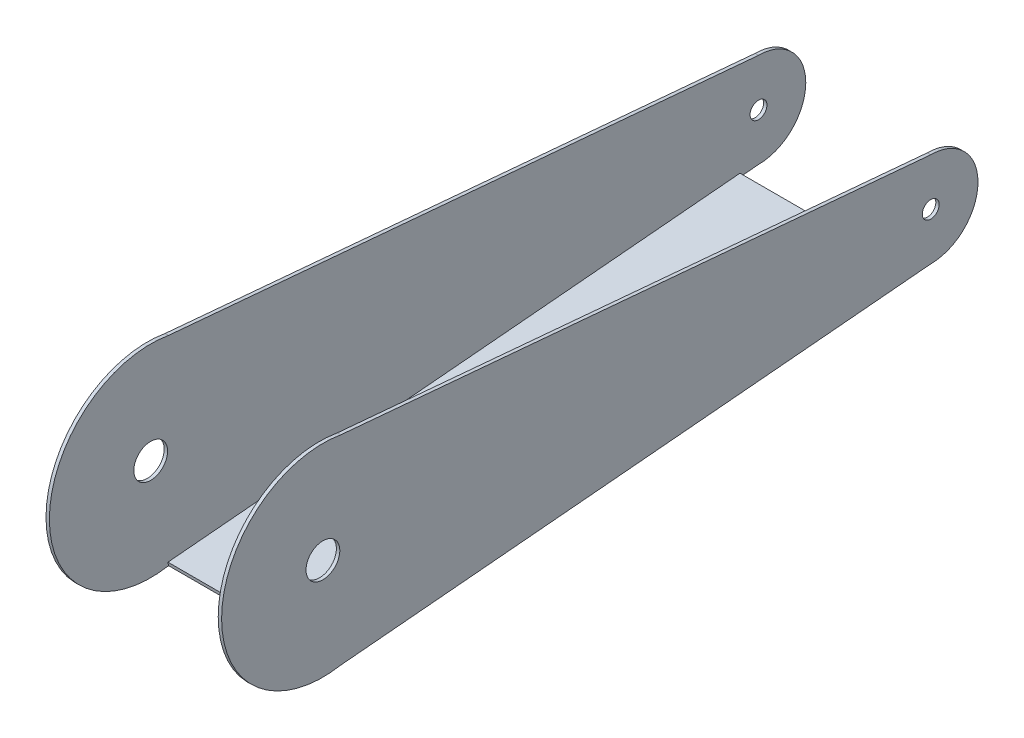
ISO-10303-21;
HEADER;
FILE_DESCRIPTION(('STEP AP214'),'2;1');
FILE_NAME('part.step','',(''),(''),'','','');
FILE_SCHEMA(('AUTOMOTIVE_DESIGN { 1 0 10303 214 1 1 1 1 }'));
ENDSEC;
DATA;
#1=APPLICATION_CONTEXT('core data for automotive mechanical design processes');
#2=APPLICATION_PROTOCOL_DEFINITION('international standard','automotive_design',2000,#1);
#3=PRODUCT_CONTEXT('',#1,'mechanical');
#4=PRODUCT('Part','Part','',(#3));
#5=PRODUCT_RELATED_PRODUCT_CATEGORY('part','',(#4));
#6=PRODUCT_DEFINITION_FORMATION('','',#4);
#7=PRODUCT_DEFINITION_CONTEXT('part definition',#1,'design');
#8=PRODUCT_DEFINITION('design','',#6,#7);
#9=PRODUCT_DEFINITION_SHAPE('','',#8);
#10=(LENGTH_UNIT() NAMED_UNIT(*) SI_UNIT(.MILLI.,.METRE.));
#11=(NAMED_UNIT(*) PLANE_ANGLE_UNIT() SI_UNIT($,.RADIAN.));
#12=(NAMED_UNIT(*) SI_UNIT($,.STERADIAN.) SOLID_ANGLE_UNIT());
#13=UNCERTAINTY_MEASURE_WITH_UNIT(LENGTH_MEASURE(1.E-05),#10,'distance_accuracy_value','');
#14=(GEOMETRIC_REPRESENTATION_CONTEXT(3) GLOBAL_UNCERTAINTY_ASSIGNED_CONTEXT((#13)) GLOBAL_UNIT_ASSIGNED_CONTEXT((#10,
#11,#12)) REPRESENTATION_CONTEXT('',''));
#15=CARTESIAN_POINT('',(0.,0.,0.));
#16=DIRECTION('',(0.,0.,1.));
#17=DIRECTION('',(1.,0.,0.));
#18=AXIS2_PLACEMENT_3D('',#15,#16,#17);
#19=CARTESIAN_POINT('',(26.,0.,0.));
#20=DIRECTION('',(-1.,0.,0.));
#21=DIRECTION('',(0.,0.,1.));
#22=AXIS2_PLACEMENT_3D('',#19,#20,#21);
#23=CYLINDRICAL_SURFACE('',#22,30.);
#24=CARTESIAN_POINT('',(-25.,0.,0.));
#25=DIRECTION('',(1.,0.,0.));
#26=DIRECTION('',(0.,0.,-1.));
#27=AXIS2_PLACEMENT_3D('',#24,#25,#26);
#28=CIRCLE('',#27,30.);
#29=CARTESIAN_POINT('',(-25.,29.5296423321901,-5.29152376286136));
#30=VERTEX_POINT('',#29);
#31=CARTESIAN_POINT('',(-25.,-29.5296423321901,-5.29152376286136));
#32=VERTEX_POINT('',#31);
#33=EDGE_CURVE('E145',#30,#32,#28,.T.);
#34=ORIENTED_EDGE('',*,*,#33,.F.);
#35=DIRECTION('',(-1.,0.,0.));
#36=VECTOR('',#35,1.);
#37=CARTESIAN_POINT('',(26.,29.5296423321901,-5.29152376286135));
#38=LINE('',#37,#36);
#39=CARTESIAN_POINT('',(-26.,29.5296423321901,-5.29152376286135));
#40=VERTEX_POINT('',#39);
#41=EDGE_CURVE('E81',#30,#40,#38,.T.);
#42=ORIENTED_EDGE('',*,*,#41,.T.);
#43=CARTESIAN_POINT('',(-26.,0.,0.));
#44=DIRECTION('',(1.,0.,0.));
#45=DIRECTION('',(0.,0.,-1.));
#46=AXIS2_PLACEMENT_3D('',#43,#44,#45);
#47=CIRCLE('',#46,30.);
#48=CARTESIAN_POINT('',(-26.,-29.5296423321901,-5.29152376286135));
#49=VERTEX_POINT('',#48);
#50=EDGE_CURVE('E195',#40,#49,#47,.T.);
#51=ORIENTED_EDGE('',*,*,#50,.T.);
#52=DIRECTION('',(-1.,0.,0.));
#53=VECTOR('',#52,1.);
#54=CARTESIAN_POINT('',(26.,-29.5296423321901,-5.29152376286135));
#55=LINE('',#54,#53);
#56=EDGE_CURVE('E42',#32,#49,#55,.T.);
#57=ORIENTED_EDGE('',*,*,#56,.F.);
#58=EDGE_LOOP('',(#34,#42,#51,#57));
#59=FACE_BOUND('',#58,.T.);
#60=ADVANCED_FACE('F33',(#59),#23,.T.);
#61=CARTESIAN_POINT('',(26.,-14.,-180.));
#62=DIRECTION('',(0.,0.996072640692687,0.0885397902837944));
#63=DIRECTION('',(0.,-0.0885397902837944,0.996072640692687));
#64=AXIS2_PLACEMENT_3D('',#61,#62,#63);
#65=PLANE('',#64);
#66=DIRECTION('',(0.,0.0885397902837943,-0.996072640692686));
#67=VECTOR('',#66,1.);
#68=CARTESIAN_POINT('',(-25.,-14.,-180.));
#69=LINE('',#68,#67);
#70=CARTESIAN_POINT('',(-25.,-14.4804390485647,-174.595060703647));
#71=VERTEX_POINT('',#70);
#72=CARTESIAN_POINT('',(-25.,-14.,-180.));
#73=VERTEX_POINT('',#72);
#74=EDGE_CURVE('E135',#71,#73,#69,.T.);
#75=ORIENTED_EDGE('',*,*,#74,.F.);
#76=DIRECTION('',(1.,0.,0.));
#77=VECTOR('',#76,1.);
#78=CARTESIAN_POINT('',(-25.,-14.4804390485647,-174.595060703647));
#79=LINE('',#78,#77);
#80=CARTESIAN_POINT('',(25.,-14.4804390485647,-174.595060703647));
#81=VERTEX_POINT('',#80);
#82=EDGE_CURVE('E165',#71,#81,#79,.T.);
#83=ORIENTED_EDGE('',*,*,#82,.T.);
#84=DIRECTION('',(0.,0.0885397902837943,-0.996072640692686));
#85=VECTOR('',#84,1.);
#86=CARTESIAN_POINT('',(25.,-14.,-180.));
#87=LINE('',#86,#85);
#88=CARTESIAN_POINT('',(25.,-14.,-180.));
#89=VERTEX_POINT('',#88);
#90=EDGE_CURVE('E139',#81,#89,#87,.T.);
#91=ORIENTED_EDGE('',*,*,#90,.T.);
#92=DIRECTION('',(-1.,0.,0.));
#93=VECTOR('',#92,1.);
#94=CARTESIAN_POINT('',(26.,-14.,-180.));
#95=LINE('',#94,#93);
#96=CARTESIAN_POINT('',(26.,-14.,-180.));
#97=VERTEX_POINT('',#96);
#98=EDGE_CURVE('E160',#97,#89,#95,.T.);
#99=ORIENTED_EDGE('',*,*,#98,.F.);
#100=DIRECTION('',(0.,0.0885397902837943,-0.996072640692686));
#101=VECTOR('',#100,1.);
#102=CARTESIAN_POINT('',(26.,-14.,-180.));
#103=LINE('',#102,#101);
#104=CARTESIAN_POINT('',(26.,-29.5296423321901,-5.29152376286135));
#105=VERTEX_POINT('',#104);
#106=EDGE_CURVE('E88',#105,#97,#103,.T.);
#107=ORIENTED_EDGE('',*,*,#106,.F.);
#108=CARTESIAN_POINT('',(25.,-29.5296423321901,-5.29152376286136));
#109=VERTEX_POINT('',#108);
#110=EDGE_CURVE('E11',#105,#109,#55,.T.);
#111=ORIENTED_EDGE('',*,*,#110,.T.);
#112=DIRECTION('',(1.,0.,0.));
#113=VECTOR('',#112,1.);
#114=CARTESIAN_POINT('',(-25.,-29.5296423321901,-5.29152376286136));
#115=LINE('',#114,#113);
#116=EDGE_CURVE('E180',#32,#109,#115,.T.);
#117=ORIENTED_EDGE('',*,*,#116,.F.);
#118=ORIENTED_EDGE('',*,*,#56,.T.);
#119=DIRECTION('',(0.,0.0885397902837943,-0.996072640692686));
#120=VECTOR('',#119,1.);
#121=CARTESIAN_POINT('',(-26.,-14.,-180.));
#122=LINE('',#121,#120);
#123=CARTESIAN_POINT('',(-26.,-14.,-180.));
#124=VERTEX_POINT('',#123);
#125=EDGE_CURVE('E206',#49,#124,#122,.T.);
#126=ORIENTED_EDGE('',*,*,#125,.T.);
#127=EDGE_CURVE('E155',#73,#124,#95,.T.);
#128=ORIENTED_EDGE('',*,*,#127,.F.);
#129=EDGE_LOOP('',(#75,#83,#91,#99,#107,#111,#117,#118,#126,#128));
#130=FACE_BOUND('',#129,.T.);
#131=ADVANCED_FACE('F216',(#130),#65,.F.);
#132=CARTESIAN_POINT('',(26.,0.,-180.));
#133=DIRECTION('',(-1.,0.,0.));
#134=DIRECTION('',(0.,0.,1.));
#135=AXIS2_PLACEMENT_3D('',#132,#133,#134);
#136=CYLINDRICAL_SURFACE('',#135,14.);
#137=CARTESIAN_POINT('',(-25.,0.,-180.));
#138=DIRECTION('',(1.,0.,0.));
#139=DIRECTION('',(0.,0.,-1.));
#140=AXIS2_PLACEMENT_3D('',#137,#138,#139);
#141=CIRCLE('',#140,14.);
#142=CARTESIAN_POINT('',(-25.,14.,-180.));
#143=VERTEX_POINT('',#142);
#144=EDGE_CURVE('E128',#73,#143,#141,.T.);
#145=ORIENTED_EDGE('',*,*,#144,.F.);
#146=ORIENTED_EDGE('',*,*,#127,.T.);
#147=CARTESIAN_POINT('',(-26.,0.,-180.));
#148=DIRECTION('',(1.,0.,0.));
#149=DIRECTION('',(0.,0.,-1.));
#150=AXIS2_PLACEMENT_3D('',#147,#148,#149);
#151=CIRCLE('',#150,14.);
#152=CARTESIAN_POINT('',(-26.,14.,-180.));
#153=VERTEX_POINT('',#152);
#154=EDGE_CURVE('E149',#124,#153,#151,.T.);
#155=ORIENTED_EDGE('',*,*,#154,.T.);
#156=DIRECTION('',(-1.,0.,0.));
#157=VECTOR('',#156,1.);
#158=CARTESIAN_POINT('',(26.,14.,-180.));
#159=LINE('',#158,#157);
#160=EDGE_CURVE('E143',#143,#153,#159,.T.);
#161=ORIENTED_EDGE('',*,*,#160,.F.);
#162=EDGE_LOOP('',(#145,#146,#155,#161));
#163=FACE_BOUND('',#162,.T.);
#164=ADVANCED_FACE('F147',(#163),#136,.T.);
#165=CARTESIAN_POINT('',(26.,29.5296423321901,-5.29152376286135));
#166=DIRECTION('',(0.,-0.996072640692687,0.0885397902837944));
#167=DIRECTION('',(0.,-0.0885397902837944,-0.996072640692687));
#168=AXIS2_PLACEMENT_3D('',#165,#166,#167);
#169=PLANE('',#168);
#170=DIRECTION('',(0.,0.0885397902837943,0.996072640692686));
#171=VECTOR('',#170,1.);
#172=CARTESIAN_POINT('',(-25.,29.5296423321901,-5.29152376286136));
#173=LINE('',#172,#171);
#174=EDGE_CURVE('E132',#143,#30,#173,.T.);
#175=ORIENTED_EDGE('',*,*,#174,.F.);
#176=ORIENTED_EDGE('',*,*,#160,.T.);
#177=DIRECTION('',(0.,0.0885397902837943,0.996072640692686));
#178=VECTOR('',#177,1.);
#179=CARTESIAN_POINT('',(-26.,29.5296423321901,-5.29152376286135));
#180=LINE('',#179,#178);
#181=EDGE_CURVE('E200',#153,#40,#180,.T.);
#182=ORIENTED_EDGE('',*,*,#181,.T.);
#183=ORIENTED_EDGE('',*,*,#41,.F.);
#184=EDGE_LOOP('',(#175,#176,#182,#183));
#185=FACE_BOUND('',#184,.T.);
#186=ADVANCED_FACE('F142',(#185),#169,.F.);
#187=CARTESIAN_POINT('',(26.,0.,0.));
#188=DIRECTION('',(-1.,0.,0.));
#189=DIRECTION('',(0.,0.,1.));
#190=AXIS2_PLACEMENT_3D('',#187,#188,#189);
#191=CYLINDRICAL_SURFACE('',#190,5.);
#192=CARTESIAN_POINT('',(-26.,0.,0.));
#193=DIRECTION('',(1.,0.,0.));
#194=DIRECTION('',(0.,0.,-1.));
#195=AXIS2_PLACEMENT_3D('',#192,#193,#194);
#196=CIRCLE('',#195,5.);
#197=CARTESIAN_POINT('',(-26.,0.,5.));
#198=VERTEX_POINT('',#197);
#199=EDGE_CURVE('E189',#198,#198,#196,.T.);
#200=CARTESIAN_POINT('',(-25.,0.,0.));
#201=DIRECTION('',(1.,0.,0.));
#202=DIRECTION('',(0.,0.,-1.));
#203=AXIS2_PLACEMENT_3D('',#200,#201,#202);
#204=CIRCLE('',#203,5.);
#205=CARTESIAN_POINT('',(-25.,0.,5.));
#206=VERTEX_POINT('',#205);
#207=EDGE_CURVE('E182',#206,#206,#204,.T.);
#208=CARTESIAN_POINT('',(-26.,0.,5.));
#209=CARTESIAN_POINT('',(-25.9895833333333,0.,5.));
#210=CARTESIAN_POINT('',(-25.9791666666667,0.,5.));
#211=CARTESIAN_POINT('',(-25.9583333333333,0.,5.));
#212=CARTESIAN_POINT('',(-25.9479166666667,0.,5.));
#213=CARTESIAN_POINT('',(-25.9270833333333,0.,5.));
#214=CARTESIAN_POINT('',(-25.9166666666667,0.,5.));
#215=CARTESIAN_POINT('',(-25.8958333333333,0.,5.));
#216=CARTESIAN_POINT('',(-25.8854166666667,0.,5.));
#217=CARTESIAN_POINT('',(-25.8645833333333,0.,5.));
#218=CARTESIAN_POINT('',(-25.8541666666667,0.,5.));
#219=CARTESIAN_POINT('',(-25.8333333333333,0.,5.));
#220=CARTESIAN_POINT('',(-25.8229166666667,0.,5.));
#221=CARTESIAN_POINT('',(-25.8020833333333,0.,5.));
#222=CARTESIAN_POINT('',(-25.7916666666667,0.,5.));
#223=CARTESIAN_POINT('',(-25.7708333333333,0.,5.));
#224=CARTESIAN_POINT('',(-25.7604166666667,0.,5.));
#225=CARTESIAN_POINT('',(-25.7395833333333,0.,5.));
#226=CARTESIAN_POINT('',(-25.7291666666667,0.,5.));
#227=CARTESIAN_POINT('',(-25.7083333333333,0.,5.));
#228=CARTESIAN_POINT('',(-25.6979166666667,0.,5.));
#229=CARTESIAN_POINT('',(-25.6770833333333,0.,5.));
#230=CARTESIAN_POINT('',(-25.6666666666667,0.,5.));
#231=CARTESIAN_POINT('',(-25.6458333333333,0.,5.));
#232=CARTESIAN_POINT('',(-25.6354166666667,0.,5.));
#233=CARTESIAN_POINT('',(-25.6145833333333,0.,5.));
#234=CARTESIAN_POINT('',(-25.6041666666667,0.,5.));
#235=CARTESIAN_POINT('',(-25.5833333333333,0.,5.));
#236=CARTESIAN_POINT('',(-25.5729166666667,0.,5.));
#237=CARTESIAN_POINT('',(-25.5520833333333,0.,5.));
#238=CARTESIAN_POINT('',(-25.5416666666667,0.,5.));
#239=CARTESIAN_POINT('',(-25.5208333333333,0.,5.));
#240=CARTESIAN_POINT('',(-25.5104166666667,0.,5.));
#241=CARTESIAN_POINT('',(-25.4895833333333,0.,5.));
#242=CARTESIAN_POINT('',(-25.4791666666667,0.,5.));
#243=CARTESIAN_POINT('',(-25.4583333333333,0.,5.));
#244=CARTESIAN_POINT('',(-25.4479166666667,0.,5.));
#245=CARTESIAN_POINT('',(-25.4270833333333,0.,5.));
#246=CARTESIAN_POINT('',(-25.4166666666667,0.,5.));
#247=CARTESIAN_POINT('',(-25.3958333333333,0.,5.));
#248=CARTESIAN_POINT('',(-25.3854166666667,0.,5.));
#249=CARTESIAN_POINT('',(-25.3645833333333,0.,5.));
#250=CARTESIAN_POINT('',(-25.3541666666667,0.,5.));
#251=CARTESIAN_POINT('',(-25.3333333333333,0.,5.));
#252=CARTESIAN_POINT('',(-25.3229166666667,0.,5.));
#253=CARTESIAN_POINT('',(-25.3020833333333,0.,5.));
#254=CARTESIAN_POINT('',(-25.2916666666667,0.,5.));
#255=CARTESIAN_POINT('',(-25.2708333333333,0.,5.));
#256=CARTESIAN_POINT('',(-25.2604166666667,0.,5.));
#257=CARTESIAN_POINT('',(-25.2395833333333,0.,5.));
#258=CARTESIAN_POINT('',(-25.2291666666667,0.,5.));
#259=CARTESIAN_POINT('',(-25.2083333333333,0.,5.));
#260=CARTESIAN_POINT('',(-25.1979166666667,0.,5.));
#261=CARTESIAN_POINT('',(-25.1770833333333,0.,5.));
#262=CARTESIAN_POINT('',(-25.1666666666667,0.,5.));
#263=CARTESIAN_POINT('',(-25.1458333333333,0.,5.));
#264=CARTESIAN_POINT('',(-25.1354166666667,0.,5.));
#265=CARTESIAN_POINT('',(-25.1145833333333,0.,5.));
#266=CARTESIAN_POINT('',(-25.1041666666667,0.,5.));
#267=CARTESIAN_POINT('',(-25.0833333333333,0.,5.));
#268=CARTESIAN_POINT('',(-25.0729166666667,0.,5.));
#269=CARTESIAN_POINT('',(-25.0520833333333,0.,5.));
#270=CARTESIAN_POINT('',(-25.0416666666667,0.,5.));
#271=CARTESIAN_POINT('',(-25.0208333333333,0.,5.));
#272=CARTESIAN_POINT('',(-25.0104166666667,0.,5.));
#273=CARTESIAN_POINT('',(-25.,0.,5.));
#274=B_SPLINE_CURVE_WITH_KNOTS('',3,(#208,#209,#210,#211,#212,#213,#214,#215,#216,#217,#218,
#219,#220,#221,#222,#223,#224,#225,#226,#227,#228,#229,#230,#231,#232,#233,#234,#235,#236,#237,
#238,#239,#240,#241,#242,#243,#244,#245,#246,#247,#248,#249,#250,#251,#252,#253,#254,#255,#256,
#257,#258,#259,#260,#261,#262,#263,#264,#265,#266,#267,#268,#269,#270,#271,#272,#273),
.UNSPECIFIED.,.F.,.F.,(4,2,2,2,2,2,2,2,2,2,2,2,2,2,2,2,2,2,2,2,2,2,2,2,2,2,2,2,2,2,2,2,4),(0.,
0.0312499999999966,0.0625000000000001,0.0937499999999966,0.125,0.156249999999997,0.1875,
0.218749999999997,0.25,0.281249999999997,0.312499999999993,0.343749999999997,0.374999999999993,
0.406249999999997,0.437499999999993,0.468749999999997,0.499999999999994,0.53124999999999,
0.562499999999994,0.59374999999999,0.624999999999994,0.65624999999999,0.687499999999994,
0.71874999999999,0.749999999999987,0.78124999999999,0.812499999999987,0.84374999999999,
0.874999999999987,0.90624999999999,0.937499999999987,0.96874999999999,0.999999999999987),.UNSPECIFIED.);
#275=EDGE_CURVE('BSEAM269',#198,#206,#274,.T.);
#276=ORIENTED_EDGE('',*,*,#199,.F.);
#277=ORIENTED_EDGE('',*,*,#207,.T.);
#278=ORIENTED_EDGE('',*,*,#275,.T.);
#279=ORIENTED_EDGE('',*,*,#275,.F.);
#280=EDGE_LOOP('',(#276,#278,#277,#279));
#281=FACE_BOUND('',#280,.T.);
#282=ADVANCED_FACE('F269',(#281),#191,.F.);
#283=CARTESIAN_POINT('',(26.,0.,-180.));
#284=DIRECTION('',(-1.,0.,0.));
#285=DIRECTION('',(0.,0.,1.));
#286=AXIS2_PLACEMENT_3D('',#283,#284,#285);
#287=CYLINDRICAL_SURFACE('',#286,2.5);
#288=CARTESIAN_POINT('',(-26.,0.,-180.));
#289=DIRECTION('',(1.,0.,0.));
#290=DIRECTION('',(0.,0.,-1.));
#291=AXIS2_PLACEMENT_3D('',#288,#289,#290);
#292=CIRCLE('',#291,2.5);
#293=CARTESIAN_POINT('',(-26.,0.,-177.5));
#294=VERTEX_POINT('',#293);
#295=EDGE_CURVE('E185',#294,#294,#292,.T.);
#296=CARTESIAN_POINT('',(-25.,0.,-180.));
#297=DIRECTION('',(1.,0.,0.));
#298=DIRECTION('',(0.,0.,-1.));
#299=AXIS2_PLACEMENT_3D('',#296,#297,#298);
#300=CIRCLE('',#299,2.5);
#301=CARTESIAN_POINT('',(-25.,0.,-177.5));
#302=VERTEX_POINT('',#301);
#303=EDGE_CURVE('E37',#302,#302,#300,.T.);
#304=CARTESIAN_POINT('',(-26.,0.,-177.5));
#305=CARTESIAN_POINT('',(-25.9895833333333,0.,-177.5));
#306=CARTESIAN_POINT('',(-25.9791666666667,0.,-177.5));
#307=CARTESIAN_POINT('',(-25.9583333333333,0.,-177.5));
#308=CARTESIAN_POINT('',(-25.9479166666667,0.,-177.5));
#309=CARTESIAN_POINT('',(-25.9270833333333,0.,-177.5));
#310=CARTESIAN_POINT('',(-25.9166666666667,0.,-177.5));
#311=CARTESIAN_POINT('',(-25.8958333333333,0.,-177.5));
#312=CARTESIAN_POINT('',(-25.8854166666667,0.,-177.5));
#313=CARTESIAN_POINT('',(-25.8645833333333,0.,-177.5));
#314=CARTESIAN_POINT('',(-25.8541666666667,0.,-177.5));
#315=CARTESIAN_POINT('',(-25.8333333333333,0.,-177.5));
#316=CARTESIAN_POINT('',(-25.8229166666667,0.,-177.5));
#317=CARTESIAN_POINT('',(-25.8020833333333,0.,-177.5));
#318=CARTESIAN_POINT('',(-25.7916666666667,0.,-177.5));
#319=CARTESIAN_POINT('',(-25.7708333333333,0.,-177.5));
#320=CARTESIAN_POINT('',(-25.7604166666667,0.,-177.5));
#321=CARTESIAN_POINT('',(-25.7395833333333,0.,-177.5));
#322=CARTESIAN_POINT('',(-25.7291666666667,0.,-177.5));
#323=CARTESIAN_POINT('',(-25.7083333333333,0.,-177.5));
#324=CARTESIAN_POINT('',(-25.6979166666667,0.,-177.5));
#325=CARTESIAN_POINT('',(-25.6770833333333,0.,-177.5));
#326=CARTESIAN_POINT('',(-25.6666666666667,0.,-177.5));
#327=CARTESIAN_POINT('',(-25.6458333333333,0.,-177.5));
#328=CARTESIAN_POINT('',(-25.6354166666667,0.,-177.5));
#329=CARTESIAN_POINT('',(-25.6145833333333,0.,-177.5));
#330=CARTESIAN_POINT('',(-25.6041666666667,0.,-177.5));
#331=CARTESIAN_POINT('',(-25.5833333333333,0.,-177.5));
#332=CARTESIAN_POINT('',(-25.5729166666667,0.,-177.5));
#333=CARTESIAN_POINT('',(-25.5520833333333,0.,-177.5));
#334=CARTESIAN_POINT('',(-25.5416666666667,0.,-177.5));
#335=CARTESIAN_POINT('',(-25.5208333333333,0.,-177.5));
#336=CARTESIAN_POINT('',(-25.5104166666667,0.,-177.5));
#337=CARTESIAN_POINT('',(-25.4895833333333,0.,-177.5));
#338=CARTESIAN_POINT('',(-25.4791666666667,0.,-177.5));
#339=CARTESIAN_POINT('',(-25.4583333333333,0.,-177.5));
#340=CARTESIAN_POINT('',(-25.4479166666667,0.,-177.5));
#341=CARTESIAN_POINT('',(-25.4270833333333,0.,-177.5));
#342=CARTESIAN_POINT('',(-25.4166666666667,0.,-177.5));
#343=CARTESIAN_POINT('',(-25.3958333333333,0.,-177.5));
#344=CARTESIAN_POINT('',(-25.3854166666667,0.,-177.5));
#345=CARTESIAN_POINT('',(-25.3645833333333,0.,-177.5));
#346=CARTESIAN_POINT('',(-25.3541666666667,0.,-177.5));
#347=CARTESIAN_POINT('',(-25.3333333333333,0.,-177.5));
#348=CARTESIAN_POINT('',(-25.3229166666667,0.,-177.5));
#349=CARTESIAN_POINT('',(-25.3020833333333,0.,-177.5));
#350=CARTESIAN_POINT('',(-25.2916666666667,0.,-177.5));
#351=CARTESIAN_POINT('',(-25.2708333333333,0.,-177.5));
#352=CARTESIAN_POINT('',(-25.2604166666667,0.,-177.5));
#353=CARTESIAN_POINT('',(-25.2395833333333,0.,-177.5));
#354=CARTESIAN_POINT('',(-25.2291666666667,0.,-177.5));
#355=CARTESIAN_POINT('',(-25.2083333333333,0.,-177.5));
#356=CARTESIAN_POINT('',(-25.1979166666667,0.,-177.5));
#357=CARTESIAN_POINT('',(-25.1770833333333,0.,-177.5));
#358=CARTESIAN_POINT('',(-25.1666666666667,0.,-177.5));
#359=CARTESIAN_POINT('',(-25.1458333333333,0.,-177.5));
#360=CARTESIAN_POINT('',(-25.1354166666667,0.,-177.5));
#361=CARTESIAN_POINT('',(-25.1145833333333,0.,-177.5));
#362=CARTESIAN_POINT('',(-25.1041666666667,0.,-177.5));
#363=CARTESIAN_POINT('',(-25.0833333333333,0.,-177.5));
#364=CARTESIAN_POINT('',(-25.0729166666667,0.,-177.5));
#365=CARTESIAN_POINT('',(-25.0520833333333,0.,-177.5));
#366=CARTESIAN_POINT('',(-25.0416666666667,0.,-177.5));
#367=CARTESIAN_POINT('',(-25.0208333333333,0.,-177.5));
#368=CARTESIAN_POINT('',(-25.0104166666667,0.,-177.5));
#369=CARTESIAN_POINT('',(-25.,0.,-177.5));
#370=B_SPLINE_CURVE_WITH_KNOTS('',3,(#304,#305,#306,#307,#308,#309,#310,#311,#312,#313,#314,
#315,#316,#317,#318,#319,#320,#321,#322,#323,#324,#325,#326,#327,#328,#329,#330,#331,#332,#333,
#334,#335,#336,#337,#338,#339,#340,#341,#342,#343,#344,#345,#346,#347,#348,#349,#350,#351,#352,
#353,#354,#355,#356,#357,#358,#359,#360,#361,#362,#363,#364,#365,#366,#367,#368,#369),
.UNSPECIFIED.,.F.,.F.,(4,2,2,2,2,2,2,2,2,2,2,2,2,2,2,2,2,2,2,2,2,2,2,2,2,2,2,2,2,2,2,2,4),(0.,
0.0312499999999966,0.0625000000000001,0.0937499999999966,0.125,0.156249999999997,0.1875,
0.218749999999997,0.25,0.281249999999997,0.312499999999993,0.343749999999997,0.374999999999993,
0.406249999999997,0.437499999999993,0.468749999999997,0.499999999999994,0.53124999999999,
0.562499999999994,0.59374999999999,0.624999999999994,0.65624999999999,0.687499999999994,
0.71874999999999,0.749999999999987,0.78124999999999,0.812499999999987,0.84374999999999,
0.874999999999987,0.90624999999999,0.937499999999987,0.96874999999999,0.999999999999987),.UNSPECIFIED.);
#371=EDGE_CURVE('BSEAM249',#294,#302,#370,.T.);
#372=ORIENTED_EDGE('',*,*,#295,.F.);
#373=ORIENTED_EDGE('',*,*,#303,.T.);
#374=ORIENTED_EDGE('',*,*,#371,.T.);
#375=ORIENTED_EDGE('',*,*,#371,.F.);
#376=EDGE_LOOP('',(#372,#374,#373,#375));
#377=FACE_BOUND('',#376,.T.);
#378=ADVANCED_FACE('F249',(#377),#287,.F.);
#379=CARTESIAN_POINT('',(26.,0.,0.));
#380=DIRECTION('',(1.,0.,0.));
#381=DIRECTION('',(0.,0.,-1.));
#382=AXIS2_PLACEMENT_3D('',#379,#380,#381);
#383=PLANE('',#382);
#384=CARTESIAN_POINT('',(26.,0.,0.));
#385=DIRECTION('',(1.,0.,0.));
#386=DIRECTION('',(0.,0.,-1.));
#387=AXIS2_PLACEMENT_3D('',#384,#385,#386);
#388=CIRCLE('',#387,5.);
#389=CARTESIAN_POINT('',(26.,0.,5.));
#390=VERTEX_POINT('',#389);
#391=EDGE_CURVE('E192',#390,#390,#388,.T.);
#392=ORIENTED_EDGE('',*,*,#391,.F.);
#393=EDGE_LOOP('',(#392));
#394=FACE_BOUND('',#393,.T.);
#395=CARTESIAN_POINT('',(26.,0.,0.));
#396=DIRECTION('',(1.,0.,0.));
#397=DIRECTION('',(0.,0.,-1.));
#398=AXIS2_PLACEMENT_3D('',#395,#396,#397);
#399=CIRCLE('',#398,30.);
#400=CARTESIAN_POINT('',(26.,29.5296423321901,-5.29152376286135));
#401=VERTEX_POINT('',#400);
#402=EDGE_CURVE('E198',#401,#105,#399,.T.);
#403=ORIENTED_EDGE('',*,*,#402,.T.);
#404=ORIENTED_EDGE('',*,*,#106,.T.);
#405=CARTESIAN_POINT('',(26.,0.,-180.));
#406=DIRECTION('',(1.,0.,0.));
#407=DIRECTION('',(0.,0.,-1.));
#408=AXIS2_PLACEMENT_3D('',#405,#406,#407);
#409=CIRCLE('',#408,14.);
#410=CARTESIAN_POINT('',(26.,14.,-180.));
#411=VERTEX_POINT('',#410);
#412=EDGE_CURVE('E202',#97,#411,#409,.T.);
#413=ORIENTED_EDGE('',*,*,#412,.T.);
#414=DIRECTION('',(0.,0.0885397902837943,0.996072640692686));
#415=VECTOR('',#414,1.);
#416=CARTESIAN_POINT('',(26.,29.5296423321901,-5.29152376286135));
#417=LINE('',#416,#415);
#418=EDGE_CURVE('E59',#411,#401,#417,.T.);
#419=ORIENTED_EDGE('',*,*,#418,.T.);
#420=EDGE_LOOP('',(#403,#404,#413,#419));
#421=FACE_BOUND('',#420,.T.);
#422=CARTESIAN_POINT('',(26.,0.,-180.));
#423=DIRECTION('',(1.,0.,0.));
#424=DIRECTION('',(0.,0.,-1.));
#425=AXIS2_PLACEMENT_3D('',#422,#423,#424);
#426=CIRCLE('',#425,2.5);
#427=CARTESIAN_POINT('',(26.,0.,-177.5));
#428=VERTEX_POINT('',#427);
#429=EDGE_CURVE('E186',#428,#428,#426,.T.);
#430=ORIENTED_EDGE('',*,*,#429,.F.);
#431=EDGE_LOOP('',(#430));
#432=FACE_BOUND('',#431,.T.);
#433=ADVANCED_FACE('F246',(#394,#421,#432),#383,.T.);
#434=CARTESIAN_POINT('',(-26.,0.,0.));
#435=DIRECTION('',(1.,0.,0.));
#436=DIRECTION('',(0.,0.,-1.));
#437=AXIS2_PLACEMENT_3D('',#434,#435,#436);
#438=PLANE('',#437);
#439=ORIENTED_EDGE('',*,*,#50,.F.);
#440=ORIENTED_EDGE('',*,*,#181,.F.);
#441=ORIENTED_EDGE('',*,*,#154,.F.);
#442=ORIENTED_EDGE('',*,*,#125,.F.);
#443=EDGE_LOOP('',(#439,#440,#441,#442));
#444=FACE_BOUND('',#443,.T.);
#445=ORIENTED_EDGE('',*,*,#199,.T.);
#446=EDGE_LOOP('',(#445));
#447=FACE_BOUND('',#446,.T.);
#448=ORIENTED_EDGE('',*,*,#295,.T.);
#449=EDGE_LOOP('',(#448));
#450=FACE_BOUND('',#449,.T.);
#451=ADVANCED_FACE('F212',(#444,#447,#450),#438,.F.);
#452=CARTESIAN_POINT('',(25.,29.5296423321901,-5.29152376286135));
#453=VERTEX_POINT('',#452);
#454=EDGE_CURVE('E152',#401,#453,#38,.T.);
#455=ORIENTED_EDGE('',*,*,#454,.T.);
#456=CARTESIAN_POINT('',(25.,0.,0.));
#457=DIRECTION('',(1.,0.,0.));
#458=DIRECTION('',(0.,0.,-1.));
#459=AXIS2_PLACEMENT_3D('',#456,#457,#458);
#460=CIRCLE('',#459,30.);
#461=EDGE_CURVE('E50',#453,#109,#460,.T.);
#462=ORIENTED_EDGE('',*,*,#461,.T.);
#463=ORIENTED_EDGE('',*,*,#110,.F.);
#464=ORIENTED_EDGE('',*,*,#402,.F.);
#465=EDGE_LOOP('',(#455,#462,#463,#464));
#466=FACE_BOUND('',#465,.T.);
#467=ADVANCED_FACE('F35',(#466),#23,.T.);
#468=ORIENTED_EDGE('',*,*,#98,.T.);
#469=CARTESIAN_POINT('',(25.,0.,-180.));
#470=DIRECTION('',(1.,0.,0.));
#471=DIRECTION('',(0.,0.,-1.));
#472=AXIS2_PLACEMENT_3D('',#469,#470,#471);
#473=CIRCLE('',#472,14.);
#474=CARTESIAN_POINT('',(25.,14.,-180.));
#475=VERTEX_POINT('',#474);
#476=EDGE_CURVE('E234',#89,#475,#473,.T.);
#477=ORIENTED_EDGE('',*,*,#476,.T.);
#478=EDGE_CURVE('E151',#411,#475,#159,.T.);
#479=ORIENTED_EDGE('',*,*,#478,.F.);
#480=ORIENTED_EDGE('',*,*,#412,.F.);
#481=EDGE_LOOP('',(#468,#477,#479,#480));
#482=FACE_BOUND('',#481,.T.);
#483=ADVANCED_FACE('F244',(#482),#136,.T.);
#484=ORIENTED_EDGE('',*,*,#478,.T.);
#485=DIRECTION('',(0.,0.0885397902837943,0.996072640692686));
#486=VECTOR('',#485,1.);
#487=CARTESIAN_POINT('',(25.,29.5296423321901,-5.29152376286136));
#488=LINE('',#487,#486);
#489=EDGE_CURVE('E232',#475,#453,#488,.T.);
#490=ORIENTED_EDGE('',*,*,#489,.T.);
#491=ORIENTED_EDGE('',*,*,#454,.F.);
#492=ORIENTED_EDGE('',*,*,#418,.F.);
#493=EDGE_LOOP('',(#484,#490,#491,#492));
#494=FACE_BOUND('',#493,.T.);
#495=ADVANCED_FACE('F266',(#494),#169,.F.);
#496=CARTESIAN_POINT('',(25.,0.,0.));
#497=DIRECTION('',(1.,0.,0.));
#498=DIRECTION('',(0.,0.,-1.));
#499=AXIS2_PLACEMENT_3D('',#496,#497,#498);
#500=CIRCLE('',#499,5.);
#501=CARTESIAN_POINT('',(25.,0.,5.));
#502=VERTEX_POINT('',#501);
#503=EDGE_CURVE('E164',#502,#502,#500,.T.);
#504=CARTESIAN_POINT('',(25.,0.,5.));
#505=CARTESIAN_POINT('',(25.0104166666667,0.,5.));
#506=CARTESIAN_POINT('',(25.0208333333333,0.,5.));
#507=CARTESIAN_POINT('',(25.0416666666667,0.,5.));
#508=CARTESIAN_POINT('',(25.0520833333333,0.,5.));
#509=CARTESIAN_POINT('',(25.0729166666667,0.,5.));
#510=CARTESIAN_POINT('',(25.0833333333333,0.,5.));
#511=CARTESIAN_POINT('',(25.1041666666667,0.,5.));
#512=CARTESIAN_POINT('',(25.1145833333333,0.,5.));
#513=CARTESIAN_POINT('',(25.1354166666667,0.,5.));
#514=CARTESIAN_POINT('',(25.1458333333333,0.,5.));
#515=CARTESIAN_POINT('',(25.1666666666667,0.,5.));
#516=CARTESIAN_POINT('',(25.1770833333333,0.,5.));
#517=CARTESIAN_POINT('',(25.1979166666667,0.,5.));
#518=CARTESIAN_POINT('',(25.2083333333333,0.,5.));
#519=CARTESIAN_POINT('',(25.2291666666667,0.,5.));
#520=CARTESIAN_POINT('',(25.2395833333333,0.,5.));
#521=CARTESIAN_POINT('',(25.2604166666667,0.,5.));
#522=CARTESIAN_POINT('',(25.2708333333333,0.,5.));
#523=CARTESIAN_POINT('',(25.2916666666667,0.,5.));
#524=CARTESIAN_POINT('',(25.3020833333333,0.,5.));
#525=CARTESIAN_POINT('',(25.3229166666667,0.,5.));
#526=CARTESIAN_POINT('',(25.3333333333333,0.,5.));
#527=CARTESIAN_POINT('',(25.3541666666667,0.,5.));
#528=CARTESIAN_POINT('',(25.3645833333333,0.,5.));
#529=CARTESIAN_POINT('',(25.3854166666667,0.,5.));
#530=CARTESIAN_POINT('',(25.3958333333333,0.,5.));
#531=CARTESIAN_POINT('',(25.4166666666667,0.,5.));
#532=CARTESIAN_POINT('',(25.4270833333333,0.,5.));
#533=CARTESIAN_POINT('',(25.4479166666667,0.,5.));
#534=CARTESIAN_POINT('',(25.4583333333333,0.,5.));
#535=CARTESIAN_POINT('',(25.4791666666667,0.,5.));
#536=CARTESIAN_POINT('',(25.4895833333333,0.,5.));
#537=CARTESIAN_POINT('',(25.5104166666667,0.,5.));
#538=CARTESIAN_POINT('',(25.5208333333333,0.,5.));
#539=CARTESIAN_POINT('',(25.5416666666667,0.,5.));
#540=CARTESIAN_POINT('',(25.5520833333333,0.,5.));
#541=CARTESIAN_POINT('',(25.5729166666667,0.,5.));
#542=CARTESIAN_POINT('',(25.5833333333333,0.,5.));
#543=CARTESIAN_POINT('',(25.6041666666667,0.,5.));
#544=CARTESIAN_POINT('',(25.6145833333333,0.,5.));
#545=CARTESIAN_POINT('',(25.6354166666667,0.,5.));
#546=CARTESIAN_POINT('',(25.6458333333333,0.,5.));
#547=CARTESIAN_POINT('',(25.6666666666667,0.,5.));
#548=CARTESIAN_POINT('',(25.6770833333333,0.,5.));
#549=CARTESIAN_POINT('',(25.6979166666667,0.,5.));
#550=CARTESIAN_POINT('',(25.7083333333333,0.,5.));
#551=CARTESIAN_POINT('',(25.7291666666667,0.,5.));
#552=CARTESIAN_POINT('',(25.7395833333333,0.,5.));
#553=CARTESIAN_POINT('',(25.7604166666667,0.,5.));
#554=CARTESIAN_POINT('',(25.7708333333333,0.,5.));
#555=CARTESIAN_POINT('',(25.7916666666667,0.,5.));
#556=CARTESIAN_POINT('',(25.8020833333333,0.,5.));
#557=CARTESIAN_POINT('',(25.8229166666667,0.,5.));
#558=CARTESIAN_POINT('',(25.8333333333333,0.,5.));
#559=CARTESIAN_POINT('',(25.8541666666667,0.,5.));
#560=CARTESIAN_POINT('',(25.8645833333333,0.,5.));
#561=CARTESIAN_POINT('',(25.8854166666667,0.,5.));
#562=CARTESIAN_POINT('',(25.8958333333333,0.,5.));
#563=CARTESIAN_POINT('',(25.9166666666667,0.,5.));
#564=CARTESIAN_POINT('',(25.9270833333333,0.,5.));
#565=CARTESIAN_POINT('',(25.9479166666667,0.,5.));
#566=CARTESIAN_POINT('',(25.9583333333333,0.,5.));
#567=CARTESIAN_POINT('',(25.9791666666667,0.,5.));
#568=CARTESIAN_POINT('',(25.9895833333333,0.,5.));
#569=CARTESIAN_POINT('',(26.,0.,5.));
#570=B_SPLINE_CURVE_WITH_KNOTS('',3,(#504,#505,#506,#507,#508,#509,#510,#511,#512,#513,#514,
#515,#516,#517,#518,#519,#520,#521,#522,#523,#524,#525,#526,#527,#528,#529,#530,#531,#532,#533,
#534,#535,#536,#537,#538,#539,#540,#541,#542,#543,#544,#545,#546,#547,#548,#549,#550,#551,#552,
#553,#554,#555,#556,#557,#558,#559,#560,#561,#562,#563,#564,#565,#566,#567,#568,#569),
.UNSPECIFIED.,.F.,.F.,(4,2,2,2,2,2,2,2,2,2,2,2,2,2,2,2,2,2,2,2,2,2,2,2,2,2,2,2,2,2,2,2,4),(0.,
0.03125,0.0625000000000001,0.0937500000000001,0.125,0.15625,0.1875,0.21875,0.25,0.28125,0.3125,
0.34375,0.375,0.40625,0.4375,0.46875,0.5,0.53125,0.5625,0.593750000000001,0.625000000000001,
0.656250000000001,0.687500000000001,0.718750000000001,0.750000000000001,0.781250000000001,
0.812500000000001,0.843750000000001,0.875000000000001,0.906250000000001,0.937500000000001,
0.968750000000001,1.),.UNSPECIFIED.);
#571=EDGE_CURVE('BSEAM257',#502,#390,#570,.T.);
#572=ORIENTED_EDGE('',*,*,#503,.F.);
#573=ORIENTED_EDGE('',*,*,#391,.T.);
#574=ORIENTED_EDGE('',*,*,#571,.T.);
#575=ORIENTED_EDGE('',*,*,#571,.F.);
#576=EDGE_LOOP('',(#572,#574,#573,#575));
#577=FACE_BOUND('',#576,.T.);
#578=ADVANCED_FACE('F257',(#577),#191,.F.);
#579=CARTESIAN_POINT('',(25.,0.,-180.));
#580=DIRECTION('',(1.,0.,0.));
#581=DIRECTION('',(0.,0.,-1.));
#582=AXIS2_PLACEMENT_3D('',#579,#580,#581);
#583=CIRCLE('',#582,2.5);
#584=CARTESIAN_POINT('',(25.,0.,-177.5));
#585=VERTEX_POINT('',#584);
#586=EDGE_CURVE('E162',#585,#585,#583,.T.);
#587=CARTESIAN_POINT('',(25.,0.,-177.5));
#588=CARTESIAN_POINT('',(25.0104166666667,0.,-177.5));
#589=CARTESIAN_POINT('',(25.0208333333333,0.,-177.5));
#590=CARTESIAN_POINT('',(25.0416666666667,0.,-177.5));
#591=CARTESIAN_POINT('',(25.0520833333333,0.,-177.5));
#592=CARTESIAN_POINT('',(25.0729166666667,0.,-177.5));
#593=CARTESIAN_POINT('',(25.0833333333333,0.,-177.5));
#594=CARTESIAN_POINT('',(25.1041666666667,0.,-177.5));
#595=CARTESIAN_POINT('',(25.1145833333333,0.,-177.5));
#596=CARTESIAN_POINT('',(25.1354166666667,0.,-177.5));
#597=CARTESIAN_POINT('',(25.1458333333333,0.,-177.5));
#598=CARTESIAN_POINT('',(25.1666666666667,0.,-177.5));
#599=CARTESIAN_POINT('',(25.1770833333333,0.,-177.5));
#600=CARTESIAN_POINT('',(25.1979166666667,0.,-177.5));
#601=CARTESIAN_POINT('',(25.2083333333333,0.,-177.5));
#602=CARTESIAN_POINT('',(25.2291666666667,0.,-177.5));
#603=CARTESIAN_POINT('',(25.2395833333333,0.,-177.5));
#604=CARTESIAN_POINT('',(25.2604166666667,0.,-177.5));
#605=CARTESIAN_POINT('',(25.2708333333333,0.,-177.5));
#606=CARTESIAN_POINT('',(25.2916666666667,0.,-177.5));
#607=CARTESIAN_POINT('',(25.3020833333333,0.,-177.5));
#608=CARTESIAN_POINT('',(25.3229166666667,0.,-177.5));
#609=CARTESIAN_POINT('',(25.3333333333333,0.,-177.5));
#610=CARTESIAN_POINT('',(25.3541666666667,0.,-177.5));
#611=CARTESIAN_POINT('',(25.3645833333333,0.,-177.5));
#612=CARTESIAN_POINT('',(25.3854166666667,0.,-177.5));
#613=CARTESIAN_POINT('',(25.3958333333333,0.,-177.5));
#614=CARTESIAN_POINT('',(25.4166666666667,0.,-177.5));
#615=CARTESIAN_POINT('',(25.4270833333333,0.,-177.5));
#616=CARTESIAN_POINT('',(25.4479166666667,0.,-177.5));
#617=CARTESIAN_POINT('',(25.4583333333333,0.,-177.5));
#618=CARTESIAN_POINT('',(25.4791666666667,0.,-177.5));
#619=CARTESIAN_POINT('',(25.4895833333333,0.,-177.5));
#620=CARTESIAN_POINT('',(25.5104166666667,0.,-177.5));
#621=CARTESIAN_POINT('',(25.5208333333333,0.,-177.5));
#622=CARTESIAN_POINT('',(25.5416666666667,0.,-177.5));
#623=CARTESIAN_POINT('',(25.5520833333333,0.,-177.5));
#624=CARTESIAN_POINT('',(25.5729166666667,0.,-177.5));
#625=CARTESIAN_POINT('',(25.5833333333333,0.,-177.5));
#626=CARTESIAN_POINT('',(25.6041666666667,0.,-177.5));
#627=CARTESIAN_POINT('',(25.6145833333333,0.,-177.5));
#628=CARTESIAN_POINT('',(25.6354166666667,0.,-177.5));
#629=CARTESIAN_POINT('',(25.6458333333333,0.,-177.5));
#630=CARTESIAN_POINT('',(25.6666666666667,0.,-177.5));
#631=CARTESIAN_POINT('',(25.6770833333333,0.,-177.5));
#632=CARTESIAN_POINT('',(25.6979166666667,0.,-177.5));
#633=CARTESIAN_POINT('',(25.7083333333333,0.,-177.5));
#634=CARTESIAN_POINT('',(25.7291666666667,0.,-177.5));
#635=CARTESIAN_POINT('',(25.7395833333333,0.,-177.5));
#636=CARTESIAN_POINT('',(25.7604166666667,0.,-177.5));
#637=CARTESIAN_POINT('',(25.7708333333333,0.,-177.5));
#638=CARTESIAN_POINT('',(25.7916666666667,0.,-177.5));
#639=CARTESIAN_POINT('',(25.8020833333333,0.,-177.5));
#640=CARTESIAN_POINT('',(25.8229166666667,0.,-177.5));
#641=CARTESIAN_POINT('',(25.8333333333333,0.,-177.5));
#642=CARTESIAN_POINT('',(25.8541666666667,0.,-177.5));
#643=CARTESIAN_POINT('',(25.8645833333333,0.,-177.5));
#644=CARTESIAN_POINT('',(25.8854166666667,0.,-177.5));
#645=CARTESIAN_POINT('',(25.8958333333333,0.,-177.5));
#646=CARTESIAN_POINT('',(25.9166666666667,0.,-177.5));
#647=CARTESIAN_POINT('',(25.9270833333333,0.,-177.5));
#648=CARTESIAN_POINT('',(25.9479166666667,0.,-177.5));
#649=CARTESIAN_POINT('',(25.9583333333333,0.,-177.5));
#650=CARTESIAN_POINT('',(25.9791666666667,0.,-177.5));
#651=CARTESIAN_POINT('',(25.9895833333333,0.,-177.5));
#652=CARTESIAN_POINT('',(26.,0.,-177.5));
#653=B_SPLINE_CURVE_WITH_KNOTS('',3,(#587,#588,#589,#590,#591,#592,#593,#594,#595,#596,#597,
#598,#599,#600,#601,#602,#603,#604,#605,#606,#607,#608,#609,#610,#611,#612,#613,#614,#615,#616,
#617,#618,#619,#620,#621,#622,#623,#624,#625,#626,#627,#628,#629,#630,#631,#632,#633,#634,#635,
#636,#637,#638,#639,#640,#641,#642,#643,#644,#645,#646,#647,#648,#649,#650,#651,#652),
.UNSPECIFIED.,.F.,.F.,(4,2,2,2,2,2,2,2,2,2,2,2,2,2,2,2,2,2,2,2,2,2,2,2,2,2,2,2,2,2,2,2,4),(0.,
0.03125,0.0625000000000001,0.0937500000000001,0.125,0.15625,0.1875,0.21875,0.25,0.28125,0.3125,
0.34375,0.375,0.40625,0.4375,0.46875,0.5,0.53125,0.5625,0.593750000000001,0.625000000000001,
0.656250000000001,0.687500000000001,0.718750000000001,0.750000000000001,0.781250000000001,
0.812500000000001,0.843750000000001,0.875000000000001,0.906250000000001,0.937500000000001,
0.968750000000001,1.),.UNSPECIFIED.);
#654=EDGE_CURVE('BSEAM254',#585,#428,#653,.T.);
#655=ORIENTED_EDGE('',*,*,#586,.F.);
#656=ORIENTED_EDGE('',*,*,#429,.T.);
#657=ORIENTED_EDGE('',*,*,#654,.T.);
#658=ORIENTED_EDGE('',*,*,#654,.F.);
#659=EDGE_LOOP('',(#655,#657,#656,#658));
#660=FACE_BOUND('',#659,.T.);
#661=ADVANCED_FACE('F254',(#660),#287,.F.);
#662=CARTESIAN_POINT('',(-25.,-14.4804390485647,-174.595060703647));
#663=DIRECTION('',(0.,-0.0885397902838064,0.996072640692686));
#664=DIRECTION('',(0.,-0.996072640692686,-0.0885397902838064));
#665=AXIS2_PLACEMENT_3D('',#662,#663,#664);
#666=PLANE('',#665);
#667=DIRECTION('',(0.,-0.996072640692685,-0.0885397902838064));
#668=VECTOR('',#667,1.);
#669=CARTESIAN_POINT('',(25.,-14.4804390485647,-174.595060703647));
#670=LINE('',#669,#668);
#671=CARTESIAN_POINT('',(25.,-13.4843664078711,-174.506520913363));
#672=VERTEX_POINT('',#671);
#673=EDGE_CURVE('E238',#672,#81,#670,.T.);
#674=ORIENTED_EDGE('',*,*,#673,.T.);
#675=ORIENTED_EDGE('',*,*,#82,.F.);
#676=DIRECTION('',(0.,-0.996072640692685,-0.0885397902838064));
#677=VECTOR('',#676,1.);
#678=CARTESIAN_POINT('',(-25.,-14.4804390485647,-174.595060703647));
#679=LINE('',#678,#677);
#680=CARTESIAN_POINT('',(-25.,-13.4843664078711,-174.506520913363));
#681=VERTEX_POINT('',#680);
#682=EDGE_CURVE('E416',#681,#71,#679,.T.);
#683=ORIENTED_EDGE('',*,*,#682,.F.);
#684=DIRECTION('',(1.,0.,0.));
#685=VECTOR('',#684,1.);
#686=CARTESIAN_POINT('',(-25.,-13.4843664078711,-174.506520913363));
#687=LINE('',#686,#685);
#688=EDGE_CURVE('E171',#681,#672,#687,.T.);
#689=ORIENTED_EDGE('',*,*,#688,.T.);
#690=EDGE_LOOP('',(#674,#675,#683,#689));
#691=FACE_BOUND('',#690,.T.);
#692=ADVANCED_FACE('F256',(#691),#666,.F.);
#693=CARTESIAN_POINT('',(-25.,-13.4843664078711,-174.506520913363));
#694=DIRECTION('',(0.,-0.996072640692686,-0.0885397902838023));
#695=DIRECTION('',(0.,0.0885397902838023,-0.996072640692686));
#696=AXIS2_PLACEMENT_3D('',#693,#694,#695);
#697=PLANE('',#696);
#698=DIRECTION('',(0.,0.0885397902838023,-0.996072640692686));
#699=VECTOR('',#698,1.);
#700=CARTESIAN_POINT('',(25.,-13.4843664078711,-174.506520913363));
#701=LINE('',#700,#699);
#702=CARTESIAN_POINT('',(25.,-28.5414398950786,-5.11444418229384));
#703=VERTEX_POINT('',#702);
#704=EDGE_CURVE('E228',#703,#672,#701,.T.);
#705=ORIENTED_EDGE('',*,*,#704,.T.);
#706=ORIENTED_EDGE('',*,*,#688,.F.);
#707=DIRECTION('',(0.,0.0885397902838023,-0.996072640692686));
#708=VECTOR('',#707,1.);
#709=CARTESIAN_POINT('',(-25.,-13.4843664078711,-174.506520913363));
#710=LINE('',#709,#708);
#711=CARTESIAN_POINT('',(-25.,-28.5414398950786,-5.11444418229384));
#712=VERTEX_POINT('',#711);
#713=EDGE_CURVE('E415',#712,#681,#710,.T.);
#714=ORIENTED_EDGE('',*,*,#713,.F.);
#715=DIRECTION('',(1.,0.,0.));
#716=VECTOR('',#715,1.);
#717=CARTESIAN_POINT('',(-25.,-28.5414398950786,-5.11444418229384));
#718=LINE('',#717,#716);
#719=EDGE_CURVE('E174',#712,#703,#718,.T.);
#720=ORIENTED_EDGE('',*,*,#719,.T.);
#721=EDGE_LOOP('',(#705,#706,#714,#720));
#722=FACE_BOUND('',#721,.T.);
#723=ADVANCED_FACE('F264',(#722),#697,.F.);
#724=CARTESIAN_POINT('',(-25.,-29.5296423321901,-5.29152376286136));
#725=DIRECTION('',(0.,0.176384125428712,-0.984321411073003));
#726=DIRECTION('',(0.,0.984321411073003,0.176384125428712));
#727=AXIS2_PLACEMENT_3D('',#724,#725,#726);
#728=PLANE('',#727);
#729=DIRECTION('',(0.,0.984321411073003,0.176384125428712));
#730=VECTOR('',#729,1.);
#731=CARTESIAN_POINT('',(25.,-29.5296423321901,-5.29152376286136));
#732=LINE('',#731,#730);
#733=EDGE_CURVE('E221',#109,#703,#732,.T.);
#734=ORIENTED_EDGE('',*,*,#733,.T.);
#735=ORIENTED_EDGE('',*,*,#719,.F.);
#736=DIRECTION('',(0.,0.984321411073003,0.176384125428712));
#737=VECTOR('',#736,1.);
#738=CARTESIAN_POINT('',(-25.,-29.5296423321901,-5.29152376286136));
#739=LINE('',#738,#737);
#740=EDGE_CURVE('E223',#32,#712,#739,.T.);
#741=ORIENTED_EDGE('',*,*,#740,.F.);
#742=ORIENTED_EDGE('',*,*,#116,.T.);
#743=EDGE_LOOP('',(#734,#735,#741,#742));
#744=FACE_BOUND('',#743,.T.);
#745=ADVANCED_FACE('F220',(#744),#728,.F.);
#746=CARTESIAN_POINT('',(-25.,0.,-180.));
#747=DIRECTION('',(1.,0.,0.));
#748=DIRECTION('',(0.,0.,-1.));
#749=AXIS2_PLACEMENT_3D('',#746,#747,#748);
#750=PLANE('',#749);
#751=ORIENTED_EDGE('',*,*,#207,.F.);
#752=EDGE_LOOP('',(#751));
#753=FACE_BOUND('',#752,.T.);
#754=ORIENTED_EDGE('',*,*,#303,.F.);
#755=EDGE_LOOP('',(#754));
#756=FACE_BOUND('',#755,.T.);
#757=ORIENTED_EDGE('',*,*,#144,.T.);
#758=ORIENTED_EDGE('',*,*,#174,.T.);
#759=ORIENTED_EDGE('',*,*,#33,.T.);
#760=ORIENTED_EDGE('',*,*,#740,.T.);
#761=ORIENTED_EDGE('',*,*,#713,.T.);
#762=ORIENTED_EDGE('',*,*,#682,.T.);
#763=ORIENTED_EDGE('',*,*,#74,.T.);
#764=EDGE_LOOP('',(#757,#758,#759,#760,#761,#762,#763));
#765=FACE_BOUND('',#764,.T.);
#766=ADVANCED_FACE('F130',(#753,#756,#765),#750,.T.);
#767=CARTESIAN_POINT('',(25.,0.,-180.));
#768=DIRECTION('',(1.,0.,0.));
#769=DIRECTION('',(0.,0.,-1.));
#770=AXIS2_PLACEMENT_3D('',#767,#768,#769);
#771=PLANE('',#770);
#772=ORIENTED_EDGE('',*,*,#503,.T.);
#773=EDGE_LOOP('',(#772));
#774=FACE_BOUND('',#773,.T.);
#775=ORIENTED_EDGE('',*,*,#586,.T.);
#776=EDGE_LOOP('',(#775));
#777=FACE_BOUND('',#776,.T.);
#778=ORIENTED_EDGE('',*,*,#476,.F.);
#779=ORIENTED_EDGE('',*,*,#90,.F.);
#780=ORIENTED_EDGE('',*,*,#673,.F.);
#781=ORIENTED_EDGE('',*,*,#704,.F.);
#782=ORIENTED_EDGE('',*,*,#733,.F.);
#783=ORIENTED_EDGE('',*,*,#461,.F.);
#784=ORIENTED_EDGE('',*,*,#489,.F.);
#785=EDGE_LOOP('',(#778,#779,#780,#781,#782,#783,#784));
#786=FACE_BOUND('',#785,.T.);
#787=ADVANCED_FACE('F225',(#774,#777,#786),#771,.F.);
#788=CLOSED_SHELL('',(#60,#131,#164,#186,#282,#378,#433,#451,#467,#483,#495,#578,#661,#692,#723,
#745,#766,#787));
#789=MANIFOLD_SOLID_BREP('B2',#788);
#790=ADVANCED_BREP_SHAPE_REPRESENTATION('',(#18,#789),#14);
#791=SHAPE_DEFINITION_REPRESENTATION(#9,#790);
ENDSEC;
END-ISO-10303-21;
